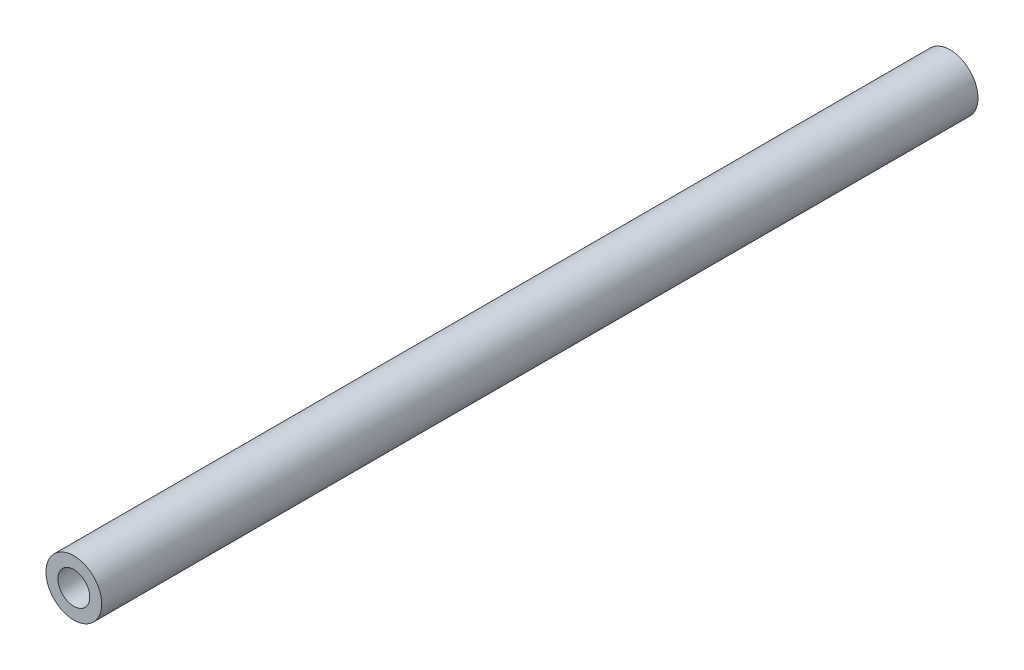
ISO-10303-21;
HEADER;
FILE_DESCRIPTION(('STEP AP214'),'2;1');
FILE_NAME('part.step','',(''),(''),'','','');
FILE_SCHEMA(('AUTOMOTIVE_DESIGN { 1 0 10303 214 1 1 1 1 }'));
ENDSEC;
DATA;
#1=APPLICATION_CONTEXT('core data for automotive mechanical design processes');
#2=APPLICATION_PROTOCOL_DEFINITION('international standard','automotive_design',2000,#1);
#3=PRODUCT_CONTEXT('',#1,'mechanical');
#4=PRODUCT('Part','Part','',(#3));
#5=PRODUCT_RELATED_PRODUCT_CATEGORY('part','',(#4));
#6=PRODUCT_DEFINITION_FORMATION('','',#4);
#7=PRODUCT_DEFINITION_CONTEXT('part definition',#1,'design');
#8=PRODUCT_DEFINITION('design','',#6,#7);
#9=PRODUCT_DEFINITION_SHAPE('','',#8);
#10=(LENGTH_UNIT() NAMED_UNIT(*) SI_UNIT(.MILLI.,.METRE.));
#11=(NAMED_UNIT(*) PLANE_ANGLE_UNIT() SI_UNIT($,.RADIAN.));
#12=(NAMED_UNIT(*) SI_UNIT($,.STERADIAN.) SOLID_ANGLE_UNIT());
#13=UNCERTAINTY_MEASURE_WITH_UNIT(LENGTH_MEASURE(1.E-05),#10,'distance_accuracy_value','');
#14=(GEOMETRIC_REPRESENTATION_CONTEXT(3) GLOBAL_UNCERTAINTY_ASSIGNED_CONTEXT((#13)) GLOBAL_UNIT_ASSIGNED_CONTEXT((#10,
#11,#12)) REPRESENTATION_CONTEXT('',''));
#15=CARTESIAN_POINT('',(0.,0.,0.));
#16=DIRECTION('',(0.,0.,1.));
#17=DIRECTION('',(1.,0.,0.));
#18=AXIS2_PLACEMENT_3D('',#15,#16,#17);
#19=CARTESIAN_POINT('',(0.,0.,220.));
#20=DIRECTION('',(0.,0.,1.));
#21=DIRECTION('',(1.,0.,0.));
#22=AXIS2_PLACEMENT_3D('',#19,#20,#21);
#23=PLANE('',#22);
#24=CARTESIAN_POINT('',(0.,0.,220.));
#25=DIRECTION('',(0.,0.,1.));
#26=DIRECTION('',(1.,0.,0.));
#27=AXIS2_PLACEMENT_3D('',#24,#25,#26);
#28=CIRCLE('',#27,7.);
#29=CARTESIAN_POINT('',(7.,0.,220.));
#30=VERTEX_POINT('',#29);
#31=EDGE_CURVE('E10',#30,#30,#28,.T.);
#32=ORIENTED_EDGE('',*,*,#31,.T.);
#33=EDGE_LOOP('',(#32));
#34=FACE_BOUND('',#33,.T.);
#35=CARTESIAN_POINT('',(0.,0.,220.));
#36=DIRECTION('',(0.,0.,1.));
#37=DIRECTION('',(1.,0.,0.));
#38=AXIS2_PLACEMENT_3D('',#35,#36,#37);
#39=CIRCLE('',#38,4.);
#40=CARTESIAN_POINT('',(4.,0.,220.));
#41=VERTEX_POINT('',#40);
#42=EDGE_CURVE('E42',#41,#41,#39,.T.);
#43=ORIENTED_EDGE('',*,*,#42,.F.);
#44=EDGE_LOOP('',(#43));
#45=FACE_BOUND('',#44,.T.);
#46=ADVANCED_FACE('F31',(#34,#45),#23,.T.);
#47=CARTESIAN_POINT('',(0.,0.,0.));
#48=DIRECTION('',(0.,0.,1.));
#49=DIRECTION('',(1.,0.,0.));
#50=AXIS2_PLACEMENT_3D('',#47,#48,#49);
#51=PLANE('',#50);
#52=CARTESIAN_POINT('',(0.,0.,0.));
#53=DIRECTION('',(0.,0.,1.));
#54=DIRECTION('',(1.,0.,0.));
#55=AXIS2_PLACEMENT_3D('',#52,#53,#54);
#56=CIRCLE('',#55,7.);
#57=CARTESIAN_POINT('',(7.,0.,0.));
#58=VERTEX_POINT('',#57);
#59=EDGE_CURVE('E35',#58,#58,#56,.T.);
#60=ORIENTED_EDGE('',*,*,#59,.F.);
#61=EDGE_LOOP('',(#60));
#62=FACE_BOUND('',#61,.T.);
#63=CARTESIAN_POINT('',(0.,0.,0.));
#64=DIRECTION('',(0.,0.,1.));
#65=DIRECTION('',(1.,0.,0.));
#66=AXIS2_PLACEMENT_3D('',#63,#64,#65);
#67=CIRCLE('',#66,4.);
#68=CARTESIAN_POINT('',(4.,0.,0.));
#69=VERTEX_POINT('',#68);
#70=EDGE_CURVE('E44',#69,#69,#67,.T.);
#71=ORIENTED_EDGE('',*,*,#70,.T.);
#72=EDGE_LOOP('',(#71));
#73=FACE_BOUND('',#72,.T.);
#74=ADVANCED_FACE('F54',(#62,#73),#51,.F.);
#75=CARTESIAN_POINT('',(0.,0.,220.));
#76=DIRECTION('',(0.,0.,-1.));
#77=DIRECTION('',(-1.,0.,0.));
#78=AXIS2_PLACEMENT_3D('',#75,#76,#77);
#79=CYLINDRICAL_SURFACE('',#78,7.);
#80=ORIENTED_EDGE('',*,*,#31,.F.);
#81=EDGE_LOOP('',(#80));
#82=FACE_BOUND('',#81,.T.);
#83=ORIENTED_EDGE('',*,*,#59,.T.);
#84=EDGE_LOOP('',(#83));
#85=FACE_BOUND('',#84,.T.);
#86=ADVANCED_FACE('F33',(#82,#85),#79,.T.);
#87=CARTESIAN_POINT('',(0.,0.,220.));
#88=DIRECTION('',(0.,0.,-1.));
#89=DIRECTION('',(-1.,0.,0.));
#90=AXIS2_PLACEMENT_3D('',#87,#88,#89);
#91=CYLINDRICAL_SURFACE('',#90,4.);
#92=ORIENTED_EDGE('',*,*,#42,.T.);
#93=EDGE_LOOP('',(#92));
#94=FACE_BOUND('',#93,.T.);
#95=ORIENTED_EDGE('',*,*,#70,.F.);
#96=EDGE_LOOP('',(#95));
#97=FACE_BOUND('',#96,.T.);
#98=ADVANCED_FACE('F50',(#94,#97),#91,.F.);
#99=CLOSED_SHELL('',(#46,#74,#86,#98));
#100=MANIFOLD_SOLID_BREP('B2',#99);
#101=ADVANCED_BREP_SHAPE_REPRESENTATION('',(#18,#100),#14);
#102=SHAPE_DEFINITION_REPRESENTATION(#9,#101);
ENDSEC;
END-ISO-10303-21;
